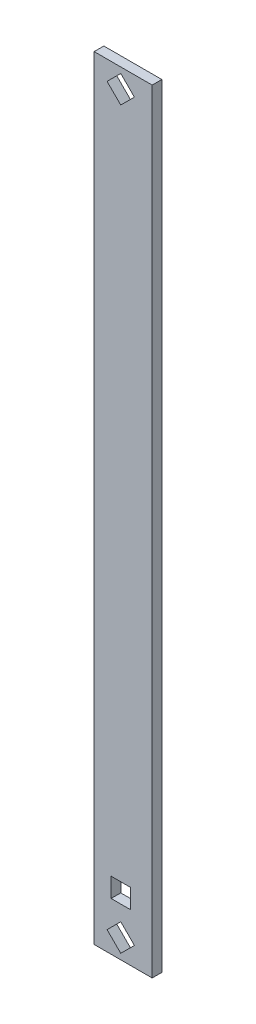
ISO-10303-21;
HEADER;
FILE_DESCRIPTION(('STEP AP214'),'2;1');
FILE_NAME('part.step','',(''),(''),'','','');
FILE_SCHEMA(('AUTOMOTIVE_DESIGN { 1 0 10303 214 1 1 1 1 }'));
ENDSEC;
DATA;
#1=APPLICATION_CONTEXT('core data for automotive mechanical design processes');
#2=APPLICATION_PROTOCOL_DEFINITION('international standard','automotive_design',2000,#1);
#3=PRODUCT_CONTEXT('',#1,'mechanical');
#4=PRODUCT('Part','Part','',(#3));
#5=PRODUCT_RELATED_PRODUCT_CATEGORY('part','',(#4));
#6=PRODUCT_DEFINITION_FORMATION('','',#4);
#7=PRODUCT_DEFINITION_CONTEXT('part definition',#1,'design');
#8=PRODUCT_DEFINITION('design','',#6,#7);
#9=PRODUCT_DEFINITION_SHAPE('','',#8);
#10=(LENGTH_UNIT() NAMED_UNIT(*) SI_UNIT(.MILLI.,.METRE.));
#11=(NAMED_UNIT(*) PLANE_ANGLE_UNIT() SI_UNIT($,.RADIAN.));
#12=(NAMED_UNIT(*) SI_UNIT($,.STERADIAN.) SOLID_ANGLE_UNIT());
#13=UNCERTAINTY_MEASURE_WITH_UNIT(LENGTH_MEASURE(1.E-05),#10,'distance_accuracy_value','');
#14=(GEOMETRIC_REPRESENTATION_CONTEXT(3) GLOBAL_UNCERTAINTY_ASSIGNED_CONTEXT((#13)) GLOBAL_UNIT_ASSIGNED_CONTEXT((#10,
#11,#12)) REPRESENTATION_CONTEXT('',''));
#15=CARTESIAN_POINT('',(0.,0.,0.));
#16=DIRECTION('',(0.,0.,1.));
#17=DIRECTION('',(1.,0.,0.));
#18=AXIS2_PLACEMENT_3D('',#15,#16,#17);
#19=CARTESIAN_POINT('',(-10.8340585797146,80.,-105.756692970029));
#20=DIRECTION('',(-1.,0.,0.));
#21=DIRECTION('',(0.,0.,1.));
#22=AXIS2_PLACEMENT_3D('',#19,#20,#21);
#23=PLANE('',#22);
#24=DIRECTION('',(0.,0.,-1.));
#25=VECTOR('',#24,1.);
#26=CARTESIAN_POINT('',(-10.8340585797146,0.,-105.756692970029));
#27=LINE('',#26,#25);
#28=CARTESIAN_POINT('',(-10.8340585797146,0.,-104.756692970029));
#29=VERTEX_POINT('',#28);
#30=CARTESIAN_POINT('',(-10.8340585797146,0.,-105.756692970029));
#31=VERTEX_POINT('',#30);
#32=EDGE_CURVE('E283',#29,#31,#27,.T.);
#33=ORIENTED_EDGE('',*,*,#32,.T.);
#34=DIRECTION('',(0.,-1.,0.));
#35=VECTOR('',#34,1.);
#36=CARTESIAN_POINT('',(-10.8340585797146,80.,-105.756692970029));
#37=LINE('',#36,#35);
#38=CARTESIAN_POINT('',(-10.8340585797146,80.,-105.756692970029));
#39=VERTEX_POINT('',#38);
#40=EDGE_CURVE('E11',#39,#31,#37,.T.);
#41=ORIENTED_EDGE('',*,*,#40,.F.);
#42=DIRECTION('',(0.,0.,-1.));
#43=VECTOR('',#42,1.);
#44=CARTESIAN_POINT('',(-10.8340585797146,80.,-105.756692970029));
#45=LINE('',#44,#43);
#46=CARTESIAN_POINT('',(-10.8340585797146,80.,-104.756692970029));
#47=VERTEX_POINT('',#46);
#48=EDGE_CURVE('E293',#47,#39,#45,.T.);
#49=ORIENTED_EDGE('',*,*,#48,.F.);
#50=DIRECTION('',(0.,-1.,0.));
#51=VECTOR('',#50,1.);
#52=CARTESIAN_POINT('',(-10.8340585797146,80.,-104.756692970029));
#53=LINE('',#52,#51);
#54=EDGE_CURVE('E307',#47,#29,#53,.T.);
#55=ORIENTED_EDGE('',*,*,#54,.T.);
#56=EDGE_LOOP('',(#33,#41,#49,#55));
#57=FACE_BOUND('',#56,.T.);
#58=ADVANCED_FACE('F42',(#57),#23,.F.);
#59=CARTESIAN_POINT('',(-10.8340585797146,80.,-105.756692970029));
#60=DIRECTION('',(0.,0.,1.));
#61=DIRECTION('',(1.,0.,0.));
#62=AXIS2_PLACEMENT_3D('',#59,#60,#61);
#63=PLANE('',#62);
#64=DIRECTION('',(-1.,0.,0.));
#65=VECTOR('',#64,1.);
#66=CARTESIAN_POINT('',(-15.0840585797146,7.,-105.756692970029));
#67=LINE('',#66,#65);
#68=CARTESIAN_POINT('',(-13.0840585797146,7.,-105.756692970029));
#69=VERTEX_POINT('',#68);
#70=CARTESIAN_POINT('',(-15.0840585797146,7.,-105.756692970029));
#71=VERTEX_POINT('',#70);
#72=EDGE_CURVE('E164',#69,#71,#67,.T.);
#73=ORIENTED_EDGE('',*,*,#72,.T.);
#74=DIRECTION('',(0.,-1.,0.));
#75=VECTOR('',#74,1.);
#76=CARTESIAN_POINT('',(-15.0840585797146,7.,-105.756692970029));
#77=LINE('',#76,#75);
#78=CARTESIAN_POINT('',(-15.0840585797146,5.,-105.756692970029));
#79=VERTEX_POINT('',#78);
#80=EDGE_CURVE('E157',#71,#79,#77,.T.);
#81=ORIENTED_EDGE('',*,*,#80,.T.);
#82=DIRECTION('',(1.,0.,0.));
#83=VECTOR('',#82,1.);
#84=CARTESIAN_POINT('',(-15.0840585797146,5.,-105.756692970029));
#85=LINE('',#84,#83);
#86=CARTESIAN_POINT('',(-13.0840585797146,5.,-105.756692970029));
#87=VERTEX_POINT('',#86);
#88=EDGE_CURVE('E167',#79,#87,#85,.T.);
#89=ORIENTED_EDGE('',*,*,#88,.T.);
#90=DIRECTION('',(0.,1.,0.));
#91=VECTOR('',#90,1.);
#92=CARTESIAN_POINT('',(-13.0840585797146,7.,-105.756692970029));
#93=LINE('',#92,#91);
#94=EDGE_CURVE('E57',#87,#69,#93,.T.);
#95=ORIENTED_EDGE('',*,*,#94,.T.);
#96=EDGE_LOOP('',(#73,#81,#89,#95));
#97=FACE_BOUND('',#96,.T.);
#98=DIRECTION('',(-0.707106781186548,-0.707106781186547,0.));
#99=VECTOR('',#98,1.);
#100=CARTESIAN_POINT('',(-12.6698450173415,78.,-105.756692970029));
#101=LINE('',#100,#99);
#102=CARTESIAN_POINT('',(-12.6698450173415,78.,-105.756692970029));
#103=VERTEX_POINT('',#102);
#104=CARTESIAN_POINT('',(-14.0840585797146,76.5857864376269,-105.756692970029));
#105=VERTEX_POINT('',#104);
#106=EDGE_CURVE('E208',#103,#105,#101,.T.);
#107=ORIENTED_EDGE('',*,*,#106,.F.);
#108=DIRECTION('',(0.707106781186546,-0.707106781186549,0.));
#109=VECTOR('',#108,1.);
#110=CARTESIAN_POINT('',(-14.0840585797146,79.4142135623731,-105.756692970029));
#111=LINE('',#110,#109);
#112=CARTESIAN_POINT('',(-14.0840585797146,79.4142135623731,-105.756692970029));
#113=VERTEX_POINT('',#112);
#114=EDGE_CURVE('E245',#113,#103,#111,.T.);
#115=ORIENTED_EDGE('',*,*,#114,.F.);
#116=DIRECTION('',(0.707106781186549,0.707106781186546,0.));
#117=VECTOR('',#116,1.);
#118=CARTESIAN_POINT('',(-15.4982721420877,78.,-105.756692970029));
#119=LINE('',#118,#117);
#120=CARTESIAN_POINT('',(-15.4982721420877,78.,-105.756692970029));
#121=VERTEX_POINT('',#120);
#122=EDGE_CURVE('E237',#121,#113,#119,.T.);
#123=ORIENTED_EDGE('',*,*,#122,.F.);
#124=DIRECTION('',(-0.707106781186547,0.707106781186548,0.));
#125=VECTOR('',#124,1.);
#126=CARTESIAN_POINT('',(-14.0840585797146,76.5857864376269,-105.756692970029));
#127=LINE('',#126,#125);
#128=EDGE_CURVE('E226',#105,#121,#127,.T.);
#129=ORIENTED_EDGE('',*,*,#128,.F.);
#130=EDGE_LOOP('',(#107,#115,#123,#129));
#131=FACE_BOUND('',#130,.T.);
#132=DIRECTION('',(0.707106781186549,-0.707106781186546,0.));
#133=VECTOR('',#132,1.);
#134=CARTESIAN_POINT('',(-15.4982721420877,2.,-105.756692970029));
#135=LINE('',#134,#133);
#136=CARTESIAN_POINT('',(-15.4982721420877,2.,-105.756692970029));
#137=VERTEX_POINT('',#136);
#138=CARTESIAN_POINT('',(-14.0840585797146,0.585786437626901,-105.756692970029));
#139=VERTEX_POINT('',#138);
#140=EDGE_CURVE('E262',#137,#139,#135,.T.);
#141=ORIENTED_EDGE('',*,*,#140,.T.);
#142=DIRECTION('',(0.707106781186546,0.707106781186549,0.));
#143=VECTOR('',#142,1.);
#144=CARTESIAN_POINT('',(-14.0840585797146,0.585786437626901,-105.756692970029));
#145=LINE('',#144,#143);
#146=CARTESIAN_POINT('',(-12.6698450173415,2.,-105.756692970029));
#147=VERTEX_POINT('',#146);
#148=EDGE_CURVE('E249',#139,#147,#145,.T.);
#149=ORIENTED_EDGE('',*,*,#148,.T.);
#150=DIRECTION('',(-0.707106781186548,0.707106781186547,0.));
#151=VECTOR('',#150,1.);
#152=CARTESIAN_POINT('',(-12.6698450173415,2.,-105.756692970029));
#153=LINE('',#152,#151);
#154=CARTESIAN_POINT('',(-14.0840585797146,3.41421356237309,-105.756692970029));
#155=VERTEX_POINT('',#154);
#156=EDGE_CURVE('E253',#147,#155,#153,.T.);
#157=ORIENTED_EDGE('',*,*,#156,.T.);
#158=DIRECTION('',(-0.707106781186547,-0.707106781186548,0.));
#159=VECTOR('',#158,1.);
#160=CARTESIAN_POINT('',(-14.0840585797146,3.4142135623731,-105.756692970029));
#161=LINE('',#160,#159);
#162=EDGE_CURVE('E258',#155,#137,#161,.T.);
#163=ORIENTED_EDGE('',*,*,#162,.T.);
#164=EDGE_LOOP('',(#141,#149,#157,#163));
#165=FACE_BOUND('',#164,.T.);
#166=DIRECTION('',(-1.,0.,0.));
#167=VECTOR('',#166,1.);
#168=CARTESIAN_POINT('',(-10.8340585797146,0.,-105.756692970029));
#169=LINE('',#168,#167);
#170=CARTESIAN_POINT('',(-16.8340585797146,0.,-105.756692970029));
#171=VERTEX_POINT('',#170);
#172=EDGE_CURVE('E311',#31,#171,#169,.T.);
#173=ORIENTED_EDGE('',*,*,#172,.T.);
#174=DIRECTION('',(0.,-1.,0.));
#175=VECTOR('',#174,1.);
#176=CARTESIAN_POINT('',(-16.8340585797146,80.,-105.756692970029));
#177=LINE('',#176,#175);
#178=CARTESIAN_POINT('',(-16.8340585797146,80.,-105.756692970029));
#179=VERTEX_POINT('',#178);
#180=EDGE_CURVE('E50',#179,#171,#177,.T.);
#181=ORIENTED_EDGE('',*,*,#180,.F.);
#182=DIRECTION('',(-1.,0.,0.));
#183=VECTOR('',#182,1.);
#184=CARTESIAN_POINT('',(-10.8340585797146,80.,-105.756692970029));
#185=LINE('',#184,#183);
#186=EDGE_CURVE('E297',#39,#179,#185,.T.);
#187=ORIENTED_EDGE('',*,*,#186,.F.);
#188=ORIENTED_EDGE('',*,*,#40,.T.);
#189=EDGE_LOOP('',(#173,#181,#187,#188));
#190=FACE_BOUND('',#189,.T.);
#191=ADVANCED_FACE('F172',(#97,#131,#165,#190),#63,.F.);
#192=CARTESIAN_POINT('',(-16.8340585797146,80.,-105.756692970029));
#193=DIRECTION('',(1.,0.,0.));
#194=DIRECTION('',(0.,0.,-1.));
#195=AXIS2_PLACEMENT_3D('',#192,#193,#194);
#196=PLANE('',#195);
#197=DIRECTION('',(0.,0.,1.));
#198=VECTOR('',#197,1.);
#199=CARTESIAN_POINT('',(-16.8340585797146,0.,-105.756692970029));
#200=LINE('',#199,#198);
#201=CARTESIAN_POINT('',(-16.8340585797146,0.,-104.756692970029));
#202=VERTEX_POINT('',#201);
#203=EDGE_CURVE('E314',#171,#202,#200,.T.);
#204=ORIENTED_EDGE('',*,*,#203,.T.);
#205=DIRECTION('',(0.,-1.,0.));
#206=VECTOR('',#205,1.);
#207=CARTESIAN_POINT('',(-16.8340585797146,80.,-104.756692970029));
#208=LINE('',#207,#206);
#209=CARTESIAN_POINT('',(-16.8340585797146,80.,-104.756692970029));
#210=VERTEX_POINT('',#209);
#211=EDGE_CURVE('E322',#210,#202,#208,.T.);
#212=ORIENTED_EDGE('',*,*,#211,.F.);
#213=DIRECTION('',(0.,0.,1.));
#214=VECTOR('',#213,1.);
#215=CARTESIAN_POINT('',(-16.8340585797146,80.,-105.756692970029));
#216=LINE('',#215,#214);
#217=EDGE_CURVE('E301',#179,#210,#216,.T.);
#218=ORIENTED_EDGE('',*,*,#217,.F.);
#219=ORIENTED_EDGE('',*,*,#180,.T.);
#220=EDGE_LOOP('',(#204,#212,#218,#219));
#221=FACE_BOUND('',#220,.T.);
#222=ADVANCED_FACE('F332',(#221),#196,.F.);
#223=CARTESIAN_POINT('',(-10.8340585797146,80.,-104.756692970029));
#224=DIRECTION('',(0.,0.,-1.));
#225=DIRECTION('',(-1.,0.,0.));
#226=AXIS2_PLACEMENT_3D('',#223,#224,#225);
#227=PLANE('',#226);
#228=DIRECTION('',(1.,0.,0.));
#229=VECTOR('',#228,1.);
#230=CARTESIAN_POINT('',(-15.0840585797146,5.,-104.756692970029));
#231=LINE('',#230,#229);
#232=CARTESIAN_POINT('',(-15.0840585797146,5.,-104.756692970029));
#233=VERTEX_POINT('',#232);
#234=CARTESIAN_POINT('',(-13.0840585797146,5.,-104.756692970029));
#235=VERTEX_POINT('',#234);
#236=EDGE_CURVE('E190',#233,#235,#231,.T.);
#237=ORIENTED_EDGE('',*,*,#236,.F.);
#238=DIRECTION('',(0.,-1.,0.));
#239=VECTOR('',#238,1.);
#240=CARTESIAN_POINT('',(-15.0840585797146,7.,-104.756692970029));
#241=LINE('',#240,#239);
#242=CARTESIAN_POINT('',(-15.0840585797146,7.,-104.756692970029));
#243=VERTEX_POINT('',#242);
#244=EDGE_CURVE('E65',#243,#233,#241,.T.);
#245=ORIENTED_EDGE('',*,*,#244,.F.);
#246=DIRECTION('',(-1.,0.,0.));
#247=VECTOR('',#246,1.);
#248=CARTESIAN_POINT('',(-15.0840585797146,7.,-104.756692970029));
#249=LINE('',#248,#247);
#250=CARTESIAN_POINT('',(-13.0840585797146,7.,-104.756692970029));
#251=VERTEX_POINT('',#250);
#252=EDGE_CURVE('E176',#251,#243,#249,.T.);
#253=ORIENTED_EDGE('',*,*,#252,.F.);
#254=DIRECTION('',(0.,1.,0.));
#255=VECTOR('',#254,1.);
#256=CARTESIAN_POINT('',(-13.0840585797146,7.,-104.756692970029));
#257=LINE('',#256,#255);
#258=EDGE_CURVE('E181',#235,#251,#257,.T.);
#259=ORIENTED_EDGE('',*,*,#258,.F.);
#260=EDGE_LOOP('',(#237,#245,#253,#259));
#261=FACE_BOUND('',#260,.T.);
#262=DIRECTION('',(0.707106781186549,0.707106781186546,0.));
#263=VECTOR('',#262,1.);
#264=CARTESIAN_POINT('',(-15.4982721420877,78.,-104.756692970029));
#265=LINE('',#264,#263);
#266=CARTESIAN_POINT('',(-15.4982721420877,78.,-104.756692970029));
#267=VERTEX_POINT('',#266);
#268=CARTESIAN_POINT('',(-14.0840585797146,79.4142135623731,-104.756692970029));
#269=VERTEX_POINT('',#268);
#270=EDGE_CURVE('E230',#267,#269,#265,.T.);
#271=ORIENTED_EDGE('',*,*,#270,.T.);
#272=DIRECTION('',(0.707106781186546,-0.707106781186549,0.));
#273=VECTOR('',#272,1.);
#274=CARTESIAN_POINT('',(-14.0840585797146,79.4142135623731,-104.756692970029));
#275=LINE('',#274,#273);
#276=CARTESIAN_POINT('',(-12.6698450173415,78.,-104.756692970029));
#277=VERTEX_POINT('',#276);
#278=EDGE_CURVE('E241',#269,#277,#275,.T.);
#279=ORIENTED_EDGE('',*,*,#278,.T.);
#280=DIRECTION('',(-0.707106781186548,-0.707106781186547,0.));
#281=VECTOR('',#280,1.);
#282=CARTESIAN_POINT('',(-12.6698450173415,78.,-104.756692970029));
#283=LINE('',#282,#281);
#284=CARTESIAN_POINT('',(-14.0840585797146,76.5857864376269,-104.756692970029));
#285=VERTEX_POINT('',#284);
#286=EDGE_CURVE('E199',#277,#285,#283,.T.);
#287=ORIENTED_EDGE('',*,*,#286,.T.);
#288=DIRECTION('',(-0.707106781186547,0.707106781186548,0.));
#289=VECTOR('',#288,1.);
#290=CARTESIAN_POINT('',(-14.0840585797146,76.5857864376269,-104.756692970029));
#291=LINE('',#290,#289);
#292=EDGE_CURVE('E219',#285,#267,#291,.T.);
#293=ORIENTED_EDGE('',*,*,#292,.T.);
#294=EDGE_LOOP('',(#271,#279,#287,#293));
#295=FACE_BOUND('',#294,.T.);
#296=DIRECTION('',(-0.707106781186548,0.707106781186547,0.));
#297=VECTOR('',#296,1.);
#298=CARTESIAN_POINT('',(-12.6698450173415,2.,-104.756692970029));
#299=LINE('',#298,#297);
#300=CARTESIAN_POINT('',(-12.6698450173415,2.00000000000002,-104.756692970029));
#301=VERTEX_POINT('',#300);
#302=CARTESIAN_POINT('',(-14.0840585797146,3.4142135623731,-104.756692970029));
#303=VERTEX_POINT('',#302);
#304=EDGE_CURVE('E269',#301,#303,#299,.T.);
#305=ORIENTED_EDGE('',*,*,#304,.F.);
#306=DIRECTION('',(0.707106781186546,0.707106781186549,0.));
#307=VECTOR('',#306,1.);
#308=CARTESIAN_POINT('',(-14.0840585797146,0.585786437626901,-104.756692970029));
#309=LINE('',#308,#307);
#310=CARTESIAN_POINT('',(-14.0840585797146,0.585786437626901,-104.756692970029));
#311=VERTEX_POINT('',#310);
#312=EDGE_CURVE('E248',#311,#301,#309,.T.);
#313=ORIENTED_EDGE('',*,*,#312,.F.);
#314=DIRECTION('',(0.707106781186549,-0.707106781186546,0.));
#315=VECTOR('',#314,1.);
#316=CARTESIAN_POINT('',(-15.4982721420877,2.,-104.756692970029));
#317=LINE('',#316,#315);
#318=CARTESIAN_POINT('',(-15.4982721420877,2.,-104.756692970029));
#319=VERTEX_POINT('',#318);
#320=EDGE_CURVE('E254',#319,#311,#317,.T.);
#321=ORIENTED_EDGE('',*,*,#320,.F.);
#322=DIRECTION('',(-0.707106781186547,-0.707106781186548,0.));
#323=VECTOR('',#322,1.);
#324=CARTESIAN_POINT('',(-14.0840585797146,3.4142135623731,-104.756692970029));
#325=LINE('',#324,#323);
#326=EDGE_CURVE('E273',#303,#319,#325,.T.);
#327=ORIENTED_EDGE('',*,*,#326,.F.);
#328=EDGE_LOOP('',(#305,#313,#321,#327));
#329=FACE_BOUND('',#328,.T.);
#330=DIRECTION('',(1.,0.,0.));
#331=VECTOR('',#330,1.);
#332=CARTESIAN_POINT('',(-10.8340585797146,0.,-104.756692970029));
#333=LINE('',#332,#331);
#334=EDGE_CURVE('E298',#202,#29,#333,.T.);
#335=ORIENTED_EDGE('',*,*,#334,.T.);
#336=ORIENTED_EDGE('',*,*,#54,.F.);
#337=DIRECTION('',(1.,0.,0.));
#338=VECTOR('',#337,1.);
#339=CARTESIAN_POINT('',(-10.8340585797146,80.,-104.756692970029));
#340=LINE('',#339,#338);
#341=EDGE_CURVE('E304',#210,#47,#340,.T.);
#342=ORIENTED_EDGE('',*,*,#341,.F.);
#343=ORIENTED_EDGE('',*,*,#211,.T.);
#344=EDGE_LOOP('',(#335,#336,#342,#343));
#345=FACE_BOUND('',#344,.T.);
#346=ADVANCED_FACE('F341',(#261,#295,#329,#345),#227,.F.);
#347=CARTESIAN_POINT('',(0.,80.,0.));
#348=DIRECTION('',(0.,-1.,0.));
#349=DIRECTION('',(0.,0.,-1.));
#350=AXIS2_PLACEMENT_3D('',#347,#348,#349);
#351=PLANE('',#350);
#352=ORIENTED_EDGE('',*,*,#48,.T.);
#353=ORIENTED_EDGE('',*,*,#186,.T.);
#354=ORIENTED_EDGE('',*,*,#217,.T.);
#355=ORIENTED_EDGE('',*,*,#341,.T.);
#356=EDGE_LOOP('',(#352,#353,#354,#355));
#357=FACE_BOUND('',#356,.T.);
#358=ADVANCED_FACE('F347',(#357),#351,.F.);
#359=CARTESIAN_POINT('',(0.,0.,0.));
#360=DIRECTION('',(0.,-1.,0.));
#361=DIRECTION('',(0.,0.,-1.));
#362=AXIS2_PLACEMENT_3D('',#359,#360,#361);
#363=PLANE('',#362);
#364=ORIENTED_EDGE('',*,*,#32,.F.);
#365=ORIENTED_EDGE('',*,*,#334,.F.);
#366=ORIENTED_EDGE('',*,*,#203,.F.);
#367=ORIENTED_EDGE('',*,*,#172,.F.);
#368=EDGE_LOOP('',(#364,#365,#366,#367));
#369=FACE_BOUND('',#368,.T.);
#370=ADVANCED_FACE('F338',(#369),#363,.T.);
#371=CARTESIAN_POINT('',(-14.0840585797146,0.585786437626901,-105.756692970029));
#372=DIRECTION('',(0.707106781186549,-0.707106781186546,0.));
#373=DIRECTION('',(0.707106781186546,0.707106781186549,0.));
#374=AXIS2_PLACEMENT_3D('',#371,#372,#373);
#375=PLANE('',#374);
#376=ORIENTED_EDGE('',*,*,#312,.T.);
#377=DIRECTION('',(0.,0.,1.));
#378=VECTOR('',#377,1.);
#379=CARTESIAN_POINT('',(-12.6698450173415,2.,-105.756692970029));
#380=LINE('',#379,#378);
#381=EDGE_CURVE('E266',#147,#301,#380,.T.);
#382=ORIENTED_EDGE('',*,*,#381,.F.);
#383=ORIENTED_EDGE('',*,*,#148,.F.);
#384=DIRECTION('',(0.,0.,1.));
#385=VECTOR('',#384,1.);
#386=CARTESIAN_POINT('',(-14.0840585797146,0.585786437626901,-105.756692970029));
#387=LINE('',#386,#385);
#388=EDGE_CURVE('E280',#139,#311,#387,.T.);
#389=ORIENTED_EDGE('',*,*,#388,.T.);
#390=EDGE_LOOP('',(#376,#382,#383,#389));
#391=FACE_BOUND('',#390,.T.);
#392=ADVANCED_FACE('F360',(#391),#375,.F.);
#393=CARTESIAN_POINT('',(-15.4982721420877,2.,-105.756692970029));
#394=DIRECTION('',(-0.707106781186546,-0.707106781186549,0.));
#395=DIRECTION('',(0.707106781186549,-0.707106781186546,0.));
#396=AXIS2_PLACEMENT_3D('',#393,#394,#395);
#397=PLANE('',#396);
#398=ORIENTED_EDGE('',*,*,#320,.T.);
#399=ORIENTED_EDGE('',*,*,#388,.F.);
#400=ORIENTED_EDGE('',*,*,#140,.F.);
#401=DIRECTION('',(0.,0.,1.));
#402=VECTOR('',#401,1.);
#403=CARTESIAN_POINT('',(-15.4982721420877,2.,-105.756692970029));
#404=LINE('',#403,#402);
#405=EDGE_CURVE('E284',#137,#319,#404,.T.);
#406=ORIENTED_EDGE('',*,*,#405,.T.);
#407=EDGE_LOOP('',(#398,#399,#400,#406));
#408=FACE_BOUND('',#407,.T.);
#409=ADVANCED_FACE('F365',(#408),#397,.F.);
#410=CARTESIAN_POINT('',(-14.0840585797146,3.4142135623731,-105.756692970029));
#411=DIRECTION('',(-0.707106781186548,0.707106781186547,0.));
#412=DIRECTION('',(-0.707106781186547,-0.707106781186548,0.));
#413=AXIS2_PLACEMENT_3D('',#410,#411,#412);
#414=PLANE('',#413);
#415=ORIENTED_EDGE('',*,*,#326,.T.);
#416=ORIENTED_EDGE('',*,*,#405,.F.);
#417=ORIENTED_EDGE('',*,*,#162,.F.);
#418=DIRECTION('',(0.,0.,1.));
#419=VECTOR('',#418,1.);
#420=CARTESIAN_POINT('',(-14.0840585797146,3.4142135623731,-105.756692970029));
#421=LINE('',#420,#419);
#422=EDGE_CURVE('E287',#155,#303,#421,.T.);
#423=ORIENTED_EDGE('',*,*,#422,.T.);
#424=EDGE_LOOP('',(#415,#416,#417,#423));
#425=FACE_BOUND('',#424,.T.);
#426=ADVANCED_FACE('F371',(#425),#414,.F.);
#427=CARTESIAN_POINT('',(-12.6698450173415,2.,-105.756692970029));
#428=DIRECTION('',(0.707106781186547,0.707106781186548,0.));
#429=DIRECTION('',(-0.707106781186548,0.707106781186547,0.));
#430=AXIS2_PLACEMENT_3D('',#427,#428,#429);
#431=PLANE('',#430);
#432=ORIENTED_EDGE('',*,*,#304,.T.);
#433=ORIENTED_EDGE('',*,*,#422,.F.);
#434=ORIENTED_EDGE('',*,*,#156,.F.);
#435=ORIENTED_EDGE('',*,*,#381,.T.);
#436=EDGE_LOOP('',(#432,#433,#434,#435));
#437=FACE_BOUND('',#436,.T.);
#438=ADVANCED_FACE('F367',(#437),#431,.F.);
#439=CARTESIAN_POINT('',(-14.0840585797146,79.4142135623731,-105.756692970029));
#440=DIRECTION('',(0.707106781186549,0.707106781186546,0.));
#441=DIRECTION('',(0.707106781186546,-0.707106781186549,0.));
#442=AXIS2_PLACEMENT_3D('',#439,#440,#441);
#443=PLANE('',#442);
#444=ORIENTED_EDGE('',*,*,#278,.F.);
#445=DIRECTION('',(0.,0.,1.));
#446=VECTOR('',#445,1.);
#447=CARTESIAN_POINT('',(-14.0840585797146,79.4142135623731,-105.756692970029));
#448=LINE('',#447,#446);
#449=EDGE_CURVE('E234',#113,#269,#448,.T.);
#450=ORIENTED_EDGE('',*,*,#449,.F.);
#451=ORIENTED_EDGE('',*,*,#114,.T.);
#452=DIRECTION('',(0.,0.,1.));
#453=VECTOR('',#452,1.);
#454=CARTESIAN_POINT('',(-12.6698450173415,78.,-105.756692970029));
#455=LINE('',#454,#453);
#456=EDGE_CURVE('E216',#103,#277,#455,.T.);
#457=ORIENTED_EDGE('',*,*,#456,.T.);
#458=EDGE_LOOP('',(#444,#450,#451,#457));
#459=FACE_BOUND('',#458,.T.);
#460=ADVANCED_FACE('F370',(#459),#443,.F.);
#461=CARTESIAN_POINT('',(-15.4982721420877,78.,-105.756692970029));
#462=DIRECTION('',(-0.707106781186546,0.707106781186549,0.));
#463=DIRECTION('',(0.707106781186549,0.707106781186546,0.));
#464=AXIS2_PLACEMENT_3D('',#461,#462,#463);
#465=PLANE('',#464);
#466=ORIENTED_EDGE('',*,*,#270,.F.);
#467=DIRECTION('',(0.,0.,1.));
#468=VECTOR('',#467,1.);
#469=CARTESIAN_POINT('',(-15.4982721420877,78.,-105.756692970029));
#470=LINE('',#469,#468);
#471=EDGE_CURVE('E223',#121,#267,#470,.T.);
#472=ORIENTED_EDGE('',*,*,#471,.F.);
#473=ORIENTED_EDGE('',*,*,#122,.T.);
#474=ORIENTED_EDGE('',*,*,#449,.T.);
#475=EDGE_LOOP('',(#466,#472,#473,#474));
#476=FACE_BOUND('',#475,.T.);
#477=ADVANCED_FACE('F381',(#476),#465,.F.);
#478=CARTESIAN_POINT('',(-14.0840585797146,76.5857864376269,-105.756692970029));
#479=DIRECTION('',(-0.707106781186548,-0.707106781186547,0.));
#480=DIRECTION('',(-0.707106781186547,0.707106781186548,0.));
#481=AXIS2_PLACEMENT_3D('',#478,#479,#480);
#482=PLANE('',#481);
#483=ORIENTED_EDGE('',*,*,#292,.F.);
#484=DIRECTION('',(0.,0.,1.));
#485=VECTOR('',#484,1.);
#486=CARTESIAN_POINT('',(-14.0840585797146,76.5857864376269,-105.756692970029));
#487=LINE('',#486,#485);
#488=EDGE_CURVE('E212',#105,#285,#487,.T.);
#489=ORIENTED_EDGE('',*,*,#488,.F.);
#490=ORIENTED_EDGE('',*,*,#128,.T.);
#491=ORIENTED_EDGE('',*,*,#471,.T.);
#492=EDGE_LOOP('',(#483,#489,#490,#491));
#493=FACE_BOUND('',#492,.T.);
#494=ADVANCED_FACE('F385',(#493),#482,.F.);
#495=CARTESIAN_POINT('',(-12.6698450173415,78.,-105.756692970029));
#496=DIRECTION('',(0.707106781186547,-0.707106781186548,0.));
#497=DIRECTION('',(-0.707106781186548,-0.707106781186547,0.));
#498=AXIS2_PLACEMENT_3D('',#495,#496,#497);
#499=PLANE('',#498);
#500=ORIENTED_EDGE('',*,*,#286,.F.);
#501=ORIENTED_EDGE('',*,*,#456,.F.);
#502=ORIENTED_EDGE('',*,*,#106,.T.);
#503=ORIENTED_EDGE('',*,*,#488,.T.);
#504=EDGE_LOOP('',(#500,#501,#502,#503));
#505=FACE_BOUND('',#504,.T.);
#506=ADVANCED_FACE('F389',(#505),#499,.F.);
#507=CARTESIAN_POINT('',(-15.0840585797146,7.,-105.756692970029));
#508=DIRECTION('',(-1.,0.,0.));
#509=DIRECTION('',(0.,-1.,0.));
#510=AXIS2_PLACEMENT_3D('',#507,#508,#509);
#511=PLANE('',#510);
#512=ORIENTED_EDGE('',*,*,#244,.T.);
#513=DIRECTION('',(0.,0.,1.));
#514=VECTOR('',#513,1.);
#515=CARTESIAN_POINT('',(-15.0840585797146,5.,-105.756692970029));
#516=LINE('',#515,#514);
#517=EDGE_CURVE('E153',#79,#233,#516,.T.);
#518=ORIENTED_EDGE('',*,*,#517,.F.);
#519=ORIENTED_EDGE('',*,*,#80,.F.);
#520=DIRECTION('',(0.,0.,1.));
#521=VECTOR('',#520,1.);
#522=CARTESIAN_POINT('',(-15.0840585797146,7.,-105.756692970029));
#523=LINE('',#522,#521);
#524=EDGE_CURVE('E196',#71,#243,#523,.T.);
#525=ORIENTED_EDGE('',*,*,#524,.T.);
#526=EDGE_LOOP('',(#512,#518,#519,#525));
#527=FACE_BOUND('',#526,.T.);
#528=ADVANCED_FACE('F155',(#527),#511,.F.);
#529=CARTESIAN_POINT('',(-15.0840585797146,7.,-105.756692970029));
#530=DIRECTION('',(0.,1.,0.));
#531=DIRECTION('',(0.,0.,1.));
#532=AXIS2_PLACEMENT_3D('',#529,#530,#531);
#533=PLANE('',#532);
#534=ORIENTED_EDGE('',*,*,#252,.T.);
#535=ORIENTED_EDGE('',*,*,#524,.F.);
#536=ORIENTED_EDGE('',*,*,#72,.F.);
#537=DIRECTION('',(0.,0.,1.));
#538=VECTOR('',#537,1.);
#539=CARTESIAN_POINT('',(-13.0840585797146,7.,-105.756692970029));
#540=LINE('',#539,#538);
#541=EDGE_CURVE('E200',#69,#251,#540,.T.);
#542=ORIENTED_EDGE('',*,*,#541,.T.);
#543=EDGE_LOOP('',(#534,#535,#536,#542));
#544=FACE_BOUND('',#543,.T.);
#545=ADVANCED_FACE('F396',(#544),#533,.F.);
#546=CARTESIAN_POINT('',(-13.0840585797146,7.,-105.756692970029));
#547=DIRECTION('',(1.,0.,0.));
#548=DIRECTION('',(0.,1.,0.));
#549=AXIS2_PLACEMENT_3D('',#546,#547,#548);
#550=PLANE('',#549);
#551=ORIENTED_EDGE('',*,*,#258,.T.);
#552=ORIENTED_EDGE('',*,*,#541,.F.);
#553=ORIENTED_EDGE('',*,*,#94,.F.);
#554=DIRECTION('',(0.,0.,1.));
#555=VECTOR('',#554,1.);
#556=CARTESIAN_POINT('',(-13.0840585797146,5.,-105.756692970029));
#557=LINE('',#556,#555);
#558=EDGE_CURVE('E163',#87,#235,#557,.T.);
#559=ORIENTED_EDGE('',*,*,#558,.T.);
#560=EDGE_LOOP('',(#551,#552,#553,#559));
#561=FACE_BOUND('',#560,.T.);
#562=ADVANCED_FACE('F399',(#561),#550,.F.);
#563=CARTESIAN_POINT('',(-15.0840585797146,5.,-105.756692970029));
#564=DIRECTION('',(0.,-1.,0.));
#565=DIRECTION('',(0.,0.,-1.));
#566=AXIS2_PLACEMENT_3D('',#563,#564,#565);
#567=PLANE('',#566);
#568=ORIENTED_EDGE('',*,*,#236,.T.);
#569=ORIENTED_EDGE('',*,*,#558,.F.);
#570=ORIENTED_EDGE('',*,*,#88,.F.);
#571=ORIENTED_EDGE('',*,*,#517,.T.);
#572=EDGE_LOOP('',(#568,#569,#570,#571));
#573=FACE_BOUND('',#572,.T.);
#574=ADVANCED_FACE('F168',(#573),#567,.F.);
#575=CLOSED_SHELL('',(#58,#191,#222,#346,#358,#370,#392,#409,#426,#438,#460,#477,#494,#506,#528,
#545,#562,#574));
#576=MANIFOLD_SOLID_BREP('B2',#575);
#577=ADVANCED_BREP_SHAPE_REPRESENTATION('',(#18,#576),#14);
#578=SHAPE_DEFINITION_REPRESENTATION(#9,#577);
ENDSEC;
END-ISO-10303-21;
